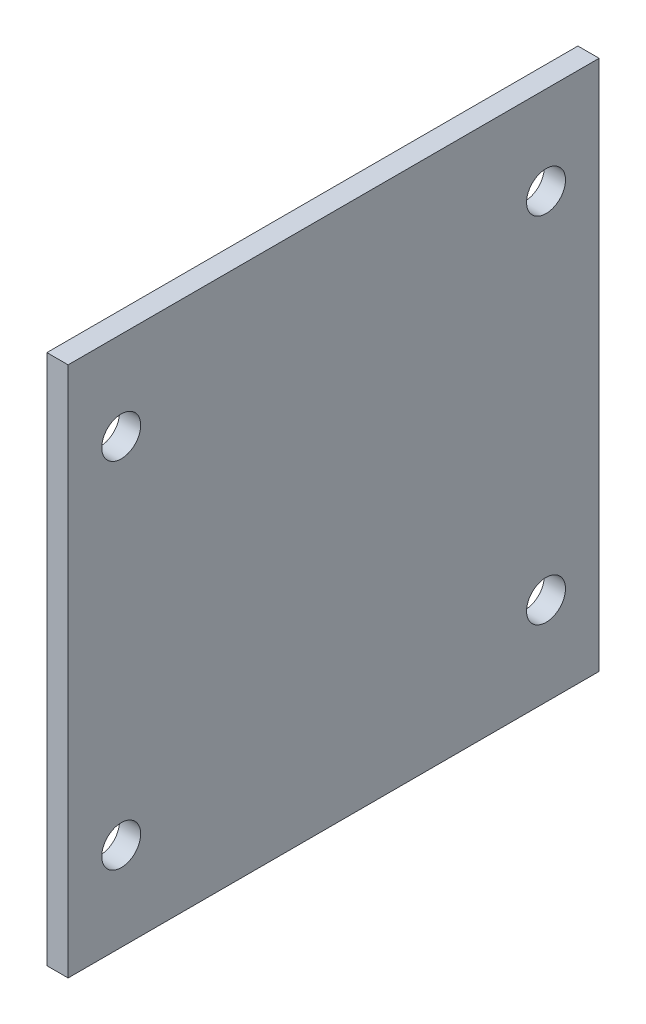
ISO-10303-21;
HEADER;
FILE_DESCRIPTION(('STEP AP214'),'2;1');
FILE_NAME('part.step','',(''),(''),'','','');
FILE_SCHEMA(('AUTOMOTIVE_DESIGN { 1 0 10303 214 1 1 1 1 }'));
ENDSEC;
DATA;
#1=APPLICATION_CONTEXT('core data for automotive mechanical design processes');
#2=APPLICATION_PROTOCOL_DEFINITION('international standard','automotive_design',2000,#1);
#3=PRODUCT_CONTEXT('',#1,'mechanical');
#4=PRODUCT('Part','Part','',(#3));
#5=PRODUCT_RELATED_PRODUCT_CATEGORY('part','',(#4));
#6=PRODUCT_DEFINITION_FORMATION('','',#4);
#7=PRODUCT_DEFINITION_CONTEXT('part definition',#1,'design');
#8=PRODUCT_DEFINITION('design','',#6,#7);
#9=PRODUCT_DEFINITION_SHAPE('','',#8);
#10=(LENGTH_UNIT() NAMED_UNIT(*) SI_UNIT(.MILLI.,.METRE.));
#11=(NAMED_UNIT(*) PLANE_ANGLE_UNIT() SI_UNIT($,.RADIAN.));
#12=(NAMED_UNIT(*) SI_UNIT($,.STERADIAN.) SOLID_ANGLE_UNIT());
#13=UNCERTAINTY_MEASURE_WITH_UNIT(LENGTH_MEASURE(1.E-05),#10,'distance_accuracy_value','');
#14=(GEOMETRIC_REPRESENTATION_CONTEXT(3) GLOBAL_UNCERTAINTY_ASSIGNED_CONTEXT((#13)) GLOBAL_UNIT_ASSIGNED_CONTEXT((#10,
#11,#12)) REPRESENTATION_CONTEXT('',''));
#15=CARTESIAN_POINT('',(0.,0.,0.));
#16=DIRECTION('',(0.,0.,1.));
#17=DIRECTION('',(1.,0.,0.));
#18=AXIS2_PLACEMENT_3D('',#15,#16,#17);
#19=CARTESIAN_POINT('',(3.,0.,0.));
#20=DIRECTION('',(-1.,0.,0.));
#21=DIRECTION('',(0.,0.,1.));
#22=AXIS2_PLACEMENT_3D('',#19,#20,#21);
#23=PLANE('',#22);
#24=DIRECTION('',(0.,1.,0.));
#25=VECTOR('',#24,1.);
#26=CARTESIAN_POINT('',(3.,107.5,-87.4999999999999));
#27=LINE('',#26,#25);
#28=CARTESIAN_POINT('',(3.,107.5,-87.4999999999999));
#29=VERTEX_POINT('',#28);
#30=CARTESIAN_POINT('',(3.,182.5,-87.4999999999999));
#31=VERTEX_POINT('',#30);
#32=EDGE_CURVE('E90',#29,#31,#27,.T.);
#33=ORIENTED_EDGE('',*,*,#32,.T.);
#34=DIRECTION('',(0.,0.,1.));
#35=VECTOR('',#34,1.);
#36=CARTESIAN_POINT('',(3.,182.5,-12.4999999999999));
#37=LINE('',#36,#35);
#38=CARTESIAN_POINT('',(3.,182.5,-12.4999999999999));
#39=VERTEX_POINT('',#38);
#40=EDGE_CURVE('E85',#31,#39,#37,.T.);
#41=ORIENTED_EDGE('',*,*,#40,.T.);
#42=DIRECTION('',(0.,-1.,0.));
#43=VECTOR('',#42,1.);
#44=CARTESIAN_POINT('',(3.,107.5,-12.4999999999999));
#45=LINE('',#44,#43);
#46=CARTESIAN_POINT('',(3.,107.5,-12.4999999999999));
#47=VERTEX_POINT('',#46);
#48=EDGE_CURVE('E88',#39,#47,#45,.T.);
#49=ORIENTED_EDGE('',*,*,#48,.T.);
#50=DIRECTION('',(0.,0.,-1.));
#51=VECTOR('',#50,1.);
#52=CARTESIAN_POINT('',(3.,107.5,-12.4999999999999));
#53=LINE('',#52,#51);
#54=EDGE_CURVE('E55',#47,#29,#53,.T.);
#55=ORIENTED_EDGE('',*,*,#54,.T.);
#56=EDGE_LOOP('',(#33,#41,#49,#55));
#57=FACE_BOUND('',#56,.T.);
#58=CARTESIAN_POINT('',(3.,170.,-80.));
#59=DIRECTION('',(1.,0.,0.));
#60=DIRECTION('',(0.,0.,-1.));
#61=AXIS2_PLACEMENT_3D('',#58,#59,#60);
#62=CIRCLE('',#61,2.75000000000001);
#63=CARTESIAN_POINT('',(3.,170.,-82.75));
#64=VERTEX_POINT('',#63);
#65=EDGE_CURVE('E105',#64,#64,#62,.T.);
#66=ORIENTED_EDGE('',*,*,#65,.F.);
#67=EDGE_LOOP('',(#66));
#68=FACE_BOUND('',#67,.T.);
#69=CARTESIAN_POINT('',(3.,170.,-19.9999999999999));
#70=DIRECTION('',(1.,0.,0.));
#71=DIRECTION('',(0.,0.,-1.));
#72=AXIS2_PLACEMENT_3D('',#69,#70,#71);
#73=CIRCLE('',#72,2.75000000000001);
#74=CARTESIAN_POINT('',(3.,170.,-22.75));
#75=VERTEX_POINT('',#74);
#76=EDGE_CURVE('E120',#75,#75,#73,.T.);
#77=ORIENTED_EDGE('',*,*,#76,.F.);
#78=EDGE_LOOP('',(#77));
#79=FACE_BOUND('',#78,.T.);
#80=CARTESIAN_POINT('',(3.,120.,-19.9999999999999));
#81=DIRECTION('',(1.,0.,0.));
#82=DIRECTION('',(0.,0.,-1.));
#83=AXIS2_PLACEMENT_3D('',#80,#81,#82);
#84=CIRCLE('',#83,2.75);
#85=CARTESIAN_POINT('',(3.,120.,-22.7499999999999));
#86=VERTEX_POINT('',#85);
#87=EDGE_CURVE('E126',#86,#86,#84,.T.);
#88=ORIENTED_EDGE('',*,*,#87,.F.);
#89=EDGE_LOOP('',(#88));
#90=FACE_BOUND('',#89,.T.);
#91=CARTESIAN_POINT('',(3.,120.,-80.));
#92=DIRECTION('',(1.,0.,0.));
#93=DIRECTION('',(0.,0.,-1.));
#94=AXIS2_PLACEMENT_3D('',#91,#92,#93);
#95=CIRCLE('',#94,2.75000000000001);
#96=CARTESIAN_POINT('',(3.,120.,-82.75));
#97=VERTEX_POINT('',#96);
#98=EDGE_CURVE('E132',#97,#97,#95,.T.);
#99=ORIENTED_EDGE('',*,*,#98,.F.);
#100=EDGE_LOOP('',(#99));
#101=FACE_BOUND('',#100,.T.);
#102=ADVANCED_FACE('F38',(#57,#68,#79,#90,#101),#23,.F.);
#103=CARTESIAN_POINT('',(0.,0.,0.));
#104=DIRECTION('',(-1.,0.,0.));
#105=DIRECTION('',(0.,0.,1.));
#106=AXIS2_PLACEMENT_3D('',#103,#104,#105);
#107=PLANE('',#106);
#108=CARTESIAN_POINT('',(0.,120.,-19.9999999999999));
#109=DIRECTION('',(1.,0.,0.));
#110=DIRECTION('',(0.,0.,-1.));
#111=AXIS2_PLACEMENT_3D('',#108,#109,#110);
#112=CIRCLE('',#111,2.75);
#113=CARTESIAN_POINT('',(0.,120.,-22.7499999999999));
#114=VERTEX_POINT('',#113);
#115=EDGE_CURVE('E129',#114,#114,#112,.T.);
#116=ORIENTED_EDGE('',*,*,#115,.T.);
#117=EDGE_LOOP('',(#116));
#118=FACE_BOUND('',#117,.T.);
#119=CARTESIAN_POINT('',(0.,170.,-80.));
#120=DIRECTION('',(1.,0.,0.));
#121=DIRECTION('',(0.,0.,-1.));
#122=AXIS2_PLACEMENT_3D('',#119,#120,#121);
#123=CIRCLE('',#122,2.75000000000001);
#124=CARTESIAN_POINT('',(0.,170.,-82.75));
#125=VERTEX_POINT('',#124);
#126=EDGE_CURVE('E117',#125,#125,#123,.T.);
#127=ORIENTED_EDGE('',*,*,#126,.T.);
#128=EDGE_LOOP('',(#127));
#129=FACE_BOUND('',#128,.T.);
#130=DIRECTION('',(0.,1.,0.));
#131=VECTOR('',#130,1.);
#132=CARTESIAN_POINT('',(0.,107.5,-87.4999999999999));
#133=LINE('',#132,#131);
#134=CARTESIAN_POINT('',(0.,107.5,-87.4999999999999));
#135=VERTEX_POINT('',#134);
#136=CARTESIAN_POINT('',(0.,182.5,-87.4999999999999));
#137=VERTEX_POINT('',#136);
#138=EDGE_CURVE('E102',#135,#137,#133,.T.);
#139=ORIENTED_EDGE('',*,*,#138,.F.);
#140=DIRECTION('',(0.,0.,-1.));
#141=VECTOR('',#140,1.);
#142=CARTESIAN_POINT('',(0.,107.5,-12.4999999999999));
#143=LINE('',#142,#141);
#144=CARTESIAN_POINT('',(0.,107.5,-12.4999999999999));
#145=VERTEX_POINT('',#144);
#146=EDGE_CURVE('E78',#145,#135,#143,.T.);
#147=ORIENTED_EDGE('',*,*,#146,.F.);
#148=DIRECTION('',(0.,-1.,0.));
#149=VECTOR('',#148,1.);
#150=CARTESIAN_POINT('',(0.,107.5,-12.4999999999999));
#151=LINE('',#150,#149);
#152=CARTESIAN_POINT('',(0.,182.5,-12.4999999999999));
#153=VERTEX_POINT('',#152);
#154=EDGE_CURVE('E72',#153,#145,#151,.T.);
#155=ORIENTED_EDGE('',*,*,#154,.F.);
#156=DIRECTION('',(0.,0.,1.));
#157=VECTOR('',#156,1.);
#158=CARTESIAN_POINT('',(0.,182.5,-12.4999999999999));
#159=LINE('',#158,#157);
#160=EDGE_CURVE('E94',#137,#153,#159,.T.);
#161=ORIENTED_EDGE('',*,*,#160,.F.);
#162=EDGE_LOOP('',(#139,#147,#155,#161));
#163=FACE_BOUND('',#162,.T.);
#164=CARTESIAN_POINT('',(0.,170.,-19.9999999999999));
#165=DIRECTION('',(1.,0.,0.));
#166=DIRECTION('',(0.,0.,-1.));
#167=AXIS2_PLACEMENT_3D('',#164,#165,#166);
#168=CIRCLE('',#167,2.75000000000001);
#169=CARTESIAN_POINT('',(0.,170.,-22.75));
#170=VERTEX_POINT('',#169);
#171=EDGE_CURVE('E123',#170,#170,#168,.T.);
#172=ORIENTED_EDGE('',*,*,#171,.T.);
#173=EDGE_LOOP('',(#172));
#174=FACE_BOUND('',#173,.T.);
#175=CARTESIAN_POINT('',(0.,120.,-80.));
#176=DIRECTION('',(1.,0.,0.));
#177=DIRECTION('',(0.,0.,-1.));
#178=AXIS2_PLACEMENT_3D('',#175,#176,#177);
#179=CIRCLE('',#178,2.75000000000001);
#180=CARTESIAN_POINT('',(0.,120.,-82.75));
#181=VERTEX_POINT('',#180);
#182=EDGE_CURVE('E135',#181,#181,#179,.T.);
#183=ORIENTED_EDGE('',*,*,#182,.T.);
#184=EDGE_LOOP('',(#183));
#185=FACE_BOUND('',#184,.T.);
#186=ADVANCED_FACE('F113',(#118,#129,#163,#174,#185),#107,.T.);
#187=CARTESIAN_POINT('',(3.,107.5,-87.4999999999999));
#188=DIRECTION('',(0.,0.,1.));
#189=DIRECTION('',(1.,0.,0.));
#190=AXIS2_PLACEMENT_3D('',#187,#188,#189);
#191=PLANE('',#190);
#192=ORIENTED_EDGE('',*,*,#138,.T.);
#193=DIRECTION('',(-1.,0.,0.));
#194=VECTOR('',#193,1.);
#195=CARTESIAN_POINT('',(3.,182.5,-87.4999999999999));
#196=LINE('',#195,#194);
#197=EDGE_CURVE('E11',#31,#137,#196,.T.);
#198=ORIENTED_EDGE('',*,*,#197,.F.);
#199=ORIENTED_EDGE('',*,*,#32,.F.);
#200=DIRECTION('',(-1.,0.,0.));
#201=VECTOR('',#200,1.);
#202=CARTESIAN_POINT('',(3.,107.5,-87.4999999999999));
#203=LINE('',#202,#201);
#204=EDGE_CURVE('E98',#29,#135,#203,.T.);
#205=ORIENTED_EDGE('',*,*,#204,.T.);
#206=EDGE_LOOP('',(#192,#198,#199,#205));
#207=FACE_BOUND('',#206,.T.);
#208=ADVANCED_FACE('F40',(#207),#191,.F.);
#209=CARTESIAN_POINT('',(3.,182.5,-12.4999999999999));
#210=DIRECTION('',(0.,-1.,0.));
#211=DIRECTION('',(0.,0.,-1.));
#212=AXIS2_PLACEMENT_3D('',#209,#210,#211);
#213=PLANE('',#212);
#214=ORIENTED_EDGE('',*,*,#160,.T.);
#215=DIRECTION('',(-1.,0.,0.));
#216=VECTOR('',#215,1.);
#217=CARTESIAN_POINT('',(3.,182.5,-12.4999999999999));
#218=LINE('',#217,#216);
#219=EDGE_CURVE('E47',#39,#153,#218,.T.);
#220=ORIENTED_EDGE('',*,*,#219,.F.);
#221=ORIENTED_EDGE('',*,*,#40,.F.);
#222=ORIENTED_EDGE('',*,*,#197,.T.);
#223=EDGE_LOOP('',(#214,#220,#221,#222));
#224=FACE_BOUND('',#223,.T.);
#225=ADVANCED_FACE('F93',(#224),#213,.F.);
#226=CARTESIAN_POINT('',(3.,107.5,-12.4999999999999));
#227=DIRECTION('',(0.,0.,-1.));
#228=DIRECTION('',(-1.,0.,0.));
#229=AXIS2_PLACEMENT_3D('',#226,#227,#228);
#230=PLANE('',#229);
#231=ORIENTED_EDGE('',*,*,#154,.T.);
#232=DIRECTION('',(-1.,0.,0.));
#233=VECTOR('',#232,1.);
#234=CARTESIAN_POINT('',(3.,107.5,-12.4999999999999));
#235=LINE('',#234,#233);
#236=EDGE_CURVE('E95',#47,#145,#235,.T.);
#237=ORIENTED_EDGE('',*,*,#236,.F.);
#238=ORIENTED_EDGE('',*,*,#48,.F.);
#239=ORIENTED_EDGE('',*,*,#219,.T.);
#240=EDGE_LOOP('',(#231,#237,#238,#239));
#241=FACE_BOUND('',#240,.T.);
#242=ADVANCED_FACE('F96',(#241),#230,.F.);
#243=CARTESIAN_POINT('',(3.,107.5,-12.4999999999999));
#244=DIRECTION('',(0.,1.,0.));
#245=DIRECTION('',(0.,0.,1.));
#246=AXIS2_PLACEMENT_3D('',#243,#244,#245);
#247=PLANE('',#246);
#248=ORIENTED_EDGE('',*,*,#146,.T.);
#249=ORIENTED_EDGE('',*,*,#204,.F.);
#250=ORIENTED_EDGE('',*,*,#54,.F.);
#251=ORIENTED_EDGE('',*,*,#236,.T.);
#252=EDGE_LOOP('',(#248,#249,#250,#251));
#253=FACE_BOUND('',#252,.T.);
#254=ADVANCED_FACE('F110',(#253),#247,.F.);
#255=CARTESIAN_POINT('',(3.,170.,-80.));
#256=DIRECTION('',(-1.,0.,0.));
#257=DIRECTION('',(0.,0.,1.));
#258=AXIS2_PLACEMENT_3D('',#255,#256,#257);
#259=CYLINDRICAL_SURFACE('',#258,2.75000000000001);
#260=ORIENTED_EDGE('',*,*,#65,.T.);
#261=EDGE_LOOP('',(#260));
#262=FACE_BOUND('',#261,.T.);
#263=ORIENTED_EDGE('',*,*,#126,.F.);
#264=EDGE_LOOP('',(#263));
#265=FACE_BOUND('',#264,.T.);
#266=ADVANCED_FACE('F152',(#262,#265),#259,.F.);
#267=CARTESIAN_POINT('',(3.,170.,-19.9999999999999));
#268=DIRECTION('',(-1.,0.,0.));
#269=DIRECTION('',(0.,0.,1.));
#270=AXIS2_PLACEMENT_3D('',#267,#268,#269);
#271=CYLINDRICAL_SURFACE('',#270,2.75000000000001);
#272=ORIENTED_EDGE('',*,*,#76,.T.);
#273=EDGE_LOOP('',(#272));
#274=FACE_BOUND('',#273,.T.);
#275=ORIENTED_EDGE('',*,*,#171,.F.);
#276=EDGE_LOOP('',(#275));
#277=FACE_BOUND('',#276,.T.);
#278=ADVANCED_FACE('F215',(#274,#277),#271,.F.);
#279=CARTESIAN_POINT('',(3.,120.,-19.9999999999999));
#280=DIRECTION('',(-1.,0.,0.));
#281=DIRECTION('',(0.,0.,1.));
#282=AXIS2_PLACEMENT_3D('',#279,#280,#281);
#283=CYLINDRICAL_SURFACE('',#282,2.75);
#284=ORIENTED_EDGE('',*,*,#87,.T.);
#285=EDGE_LOOP('',(#284));
#286=FACE_BOUND('',#285,.T.);
#287=ORIENTED_EDGE('',*,*,#115,.F.);
#288=EDGE_LOOP('',(#287));
#289=FACE_BOUND('',#288,.T.);
#290=ADVANCED_FACE('F225',(#286,#289),#283,.F.);
#291=CARTESIAN_POINT('',(3.,120.,-80.));
#292=DIRECTION('',(-1.,0.,0.));
#293=DIRECTION('',(0.,0.,1.));
#294=AXIS2_PLACEMENT_3D('',#291,#292,#293);
#295=CYLINDRICAL_SURFACE('',#294,2.75000000000001);
#296=ORIENTED_EDGE('',*,*,#98,.T.);
#297=EDGE_LOOP('',(#296));
#298=FACE_BOUND('',#297,.T.);
#299=ORIENTED_EDGE('',*,*,#182,.F.);
#300=EDGE_LOOP('',(#299));
#301=FACE_BOUND('',#300,.T.);
#302=ADVANCED_FACE('F141',(#298,#301),#295,.F.);
#303=CLOSED_SHELL('',(#102,#186,#208,#225,#242,#254,#266,#278,#290,#302));
#304=MANIFOLD_SOLID_BREP('B2',#303);
#305=ADVANCED_BREP_SHAPE_REPRESENTATION('',(#18,#304),#14);
#306=SHAPE_DEFINITION_REPRESENTATION(#9,#305);
ENDSEC;
END-ISO-10303-21;
